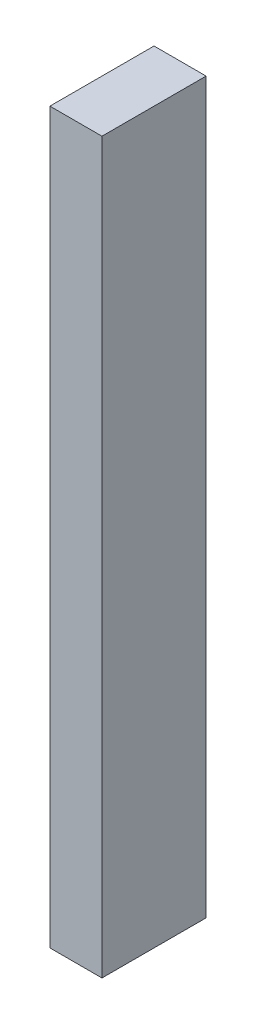
ISO-10303-21;
HEADER;
FILE_DESCRIPTION(('STEP AP214'),'2;1');
FILE_NAME('part.step','',(''),(''),'','','');
FILE_SCHEMA(('AUTOMOTIVE_DESIGN { 1 0 10303 214 1 1 1 1 }'));
ENDSEC;
DATA;
#1=APPLICATION_CONTEXT('core data for automotive mechanical design processes');
#2=APPLICATION_PROTOCOL_DEFINITION('international standard','automotive_design',2000,#1);
#3=PRODUCT_CONTEXT('',#1,'mechanical');
#4=PRODUCT('Part','Part','',(#3));
#5=PRODUCT_RELATED_PRODUCT_CATEGORY('part','',(#4));
#6=PRODUCT_DEFINITION_FORMATION('','',#4);
#7=PRODUCT_DEFINITION_CONTEXT('part definition',#1,'design');
#8=PRODUCT_DEFINITION('design','',#6,#7);
#9=PRODUCT_DEFINITION_SHAPE('','',#8);
#10=(LENGTH_UNIT() NAMED_UNIT(*) SI_UNIT(.MILLI.,.METRE.));
#11=(NAMED_UNIT(*) PLANE_ANGLE_UNIT() SI_UNIT($,.RADIAN.));
#12=(NAMED_UNIT(*) SI_UNIT($,.STERADIAN.) SOLID_ANGLE_UNIT());
#13=UNCERTAINTY_MEASURE_WITH_UNIT(LENGTH_MEASURE(1.E-05),#10,'distance_accuracy_value','');
#14=(GEOMETRIC_REPRESENTATION_CONTEXT(3) GLOBAL_UNCERTAINTY_ASSIGNED_CONTEXT((#13)) GLOBAL_UNIT_ASSIGNED_CONTEXT((#10,
#11,#12)) REPRESENTATION_CONTEXT('',''));
#15=CARTESIAN_POINT('',(0.,0.,0.));
#16=DIRECTION('',(0.,0.,1.));
#17=DIRECTION('',(1.,0.,0.));
#18=AXIS2_PLACEMENT_3D('',#15,#16,#17);
#19=CARTESIAN_POINT('',(0.,711.2,0.));
#20=DIRECTION('',(1.,0.,0.));
#21=DIRECTION('',(0.,0.,-1.));
#22=AXIS2_PLACEMENT_3D('',#19,#20,#21);
#23=PLANE('',#22);
#24=DIRECTION('',(0.,0.,1.));
#25=VECTOR('',#24,1.);
#26=CARTESIAN_POINT('',(0.,0.,0.));
#27=LINE('',#26,#25);
#28=CARTESIAN_POINT('',(0.,0.,-101.6));
#29=VERTEX_POINT('',#28);
#30=CARTESIAN_POINT('',(0.,0.,0.));
#31=VERTEX_POINT('',#30);
#32=EDGE_CURVE('E107',#29,#31,#27,.T.);
#33=ORIENTED_EDGE('',*,*,#32,.T.);
#34=DIRECTION('',(0.,-1.,0.));
#35=VECTOR('',#34,1.);
#36=CARTESIAN_POINT('',(0.,711.2,0.));
#37=LINE('',#36,#35);
#38=CARTESIAN_POINT('',(0.,711.2,0.));
#39=VERTEX_POINT('',#38);
#40=EDGE_CURVE('E11',#39,#31,#37,.T.);
#41=ORIENTED_EDGE('',*,*,#40,.F.);
#42=DIRECTION('',(0.,0.,1.));
#43=VECTOR('',#42,1.);
#44=CARTESIAN_POINT('',(0.,711.2,0.));
#45=LINE('',#44,#43);
#46=CARTESIAN_POINT('',(0.,711.2,-101.6));
#47=VERTEX_POINT('',#46);
#48=EDGE_CURVE('E91',#47,#39,#45,.T.);
#49=ORIENTED_EDGE('',*,*,#48,.F.);
#50=DIRECTION('',(0.,-1.,0.));
#51=VECTOR('',#50,1.);
#52=CARTESIAN_POINT('',(0.,711.2,-101.6));
#53=LINE('',#52,#51);
#54=EDGE_CURVE('E103',#47,#29,#53,.T.);
#55=ORIENTED_EDGE('',*,*,#54,.T.);
#56=EDGE_LOOP('',(#33,#41,#49,#55));
#57=FACE_BOUND('',#56,.T.);
#58=ADVANCED_FACE('F39',(#57),#23,.F.);
#59=CARTESIAN_POINT('',(0.,711.2,0.));
#60=DIRECTION('',(0.,0.,-1.));
#61=DIRECTION('',(-1.,0.,0.));
#62=AXIS2_PLACEMENT_3D('',#59,#60,#61);
#63=PLANE('',#62);
#64=DIRECTION('',(1.,0.,0.));
#65=VECTOR('',#64,1.);
#66=CARTESIAN_POINT('',(0.,0.,0.));
#67=LINE('',#66,#65);
#68=CARTESIAN_POINT('',(50.8,0.,0.));
#69=VERTEX_POINT('',#68);
#70=EDGE_CURVE('E96',#31,#69,#67,.T.);
#71=ORIENTED_EDGE('',*,*,#70,.T.);
#72=DIRECTION('',(0.,-1.,0.));
#73=VECTOR('',#72,1.);
#74=CARTESIAN_POINT('',(50.8,711.2,0.));
#75=LINE('',#74,#73);
#76=CARTESIAN_POINT('',(50.8,711.2,0.));
#77=VERTEX_POINT('',#76);
#78=EDGE_CURVE('E48',#77,#69,#75,.T.);
#79=ORIENTED_EDGE('',*,*,#78,.F.);
#80=DIRECTION('',(1.,0.,0.));
#81=VECTOR('',#80,1.);
#82=CARTESIAN_POINT('',(0.,711.2,0.));
#83=LINE('',#82,#81);
#84=EDGE_CURVE('E86',#39,#77,#83,.T.);
#85=ORIENTED_EDGE('',*,*,#84,.F.);
#86=ORIENTED_EDGE('',*,*,#40,.T.);
#87=EDGE_LOOP('',(#71,#79,#85,#86));
#88=FACE_BOUND('',#87,.T.);
#89=ADVANCED_FACE('F95',(#88),#63,.F.);
#90=CARTESIAN_POINT('',(50.8,711.2,0.));
#91=DIRECTION('',(-1.,0.,0.));
#92=DIRECTION('',(0.,0.,1.));
#93=AXIS2_PLACEMENT_3D('',#90,#91,#92);
#94=PLANE('',#93);
#95=DIRECTION('',(0.,0.,-1.));
#96=VECTOR('',#95,1.);
#97=CARTESIAN_POINT('',(50.8,0.,0.));
#98=LINE('',#97,#96);
#99=CARTESIAN_POINT('',(50.8,0.,-101.6));
#100=VERTEX_POINT('',#99);
#101=EDGE_CURVE('E73',#69,#100,#98,.T.);
#102=ORIENTED_EDGE('',*,*,#101,.T.);
#103=DIRECTION('',(0.,-1.,0.));
#104=VECTOR('',#103,1.);
#105=CARTESIAN_POINT('',(50.8,711.2,-101.6));
#106=LINE('',#105,#104);
#107=CARTESIAN_POINT('',(50.8,711.2,-101.6));
#108=VERTEX_POINT('',#107);
#109=EDGE_CURVE('E98',#108,#100,#106,.T.);
#110=ORIENTED_EDGE('',*,*,#109,.F.);
#111=DIRECTION('',(0.,0.,-1.));
#112=VECTOR('',#111,1.);
#113=CARTESIAN_POINT('',(50.8,711.2,0.));
#114=LINE('',#113,#112);
#115=EDGE_CURVE('E89',#77,#108,#114,.T.);
#116=ORIENTED_EDGE('',*,*,#115,.F.);
#117=ORIENTED_EDGE('',*,*,#78,.T.);
#118=EDGE_LOOP('',(#102,#110,#116,#117));
#119=FACE_BOUND('',#118,.T.);
#120=ADVANCED_FACE('F99',(#119),#94,.F.);
#121=CARTESIAN_POINT('',(0.,711.2,-101.6));
#122=DIRECTION('',(0.,0.,1.));
#123=DIRECTION('',(1.,0.,0.));
#124=AXIS2_PLACEMENT_3D('',#121,#122,#123);
#125=PLANE('',#124);
#126=DIRECTION('',(-1.,0.,0.));
#127=VECTOR('',#126,1.);
#128=CARTESIAN_POINT('',(0.,0.,-101.6));
#129=LINE('',#128,#127);
#130=EDGE_CURVE('E79',#100,#29,#129,.T.);
#131=ORIENTED_EDGE('',*,*,#130,.T.);
#132=ORIENTED_EDGE('',*,*,#54,.F.);
#133=DIRECTION('',(-1.,0.,0.));
#134=VECTOR('',#133,1.);
#135=CARTESIAN_POINT('',(0.,711.2,-101.6));
#136=LINE('',#135,#134);
#137=EDGE_CURVE('E56',#108,#47,#136,.T.);
#138=ORIENTED_EDGE('',*,*,#137,.F.);
#139=ORIENTED_EDGE('',*,*,#109,.T.);
#140=EDGE_LOOP('',(#131,#132,#138,#139));
#141=FACE_BOUND('',#140,.T.);
#142=ADVANCED_FACE('F120',(#141),#125,.F.);
#143=CARTESIAN_POINT('',(0.,711.2,0.));
#144=DIRECTION('',(0.,-1.,0.));
#145=DIRECTION('',(0.,0.,-1.));
#146=AXIS2_PLACEMENT_3D('',#143,#144,#145);
#147=PLANE('',#146);
#148=ORIENTED_EDGE('',*,*,#48,.T.);
#149=ORIENTED_EDGE('',*,*,#84,.T.);
#150=ORIENTED_EDGE('',*,*,#115,.T.);
#151=ORIENTED_EDGE('',*,*,#137,.T.);
#152=EDGE_LOOP('',(#148,#149,#150,#151));
#153=FACE_BOUND('',#152,.T.);
#154=ADVANCED_FACE('F87',(#153),#147,.F.);
#155=CARTESIAN_POINT('',(0.,0.,0.));
#156=DIRECTION('',(0.,-1.,0.));
#157=DIRECTION('',(0.,0.,-1.));
#158=AXIS2_PLACEMENT_3D('',#155,#156,#157);
#159=PLANE('',#158);
#160=ORIENTED_EDGE('',*,*,#32,.F.);
#161=ORIENTED_EDGE('',*,*,#130,.F.);
#162=ORIENTED_EDGE('',*,*,#101,.F.);
#163=ORIENTED_EDGE('',*,*,#70,.F.);
#164=EDGE_LOOP('',(#160,#161,#162,#163));
#165=FACE_BOUND('',#164,.T.);
#166=ADVANCED_FACE('F123',(#165),#159,.T.);
#167=CLOSED_SHELL('',(#58,#89,#120,#142,#154,#166));
#168=MANIFOLD_SOLID_BREP('B2',#167);
#169=ADVANCED_BREP_SHAPE_REPRESENTATION('',(#18,#168),#14);
#170=SHAPE_DEFINITION_REPRESENTATION(#9,#169);
ENDSEC;
END-ISO-10303-21;
